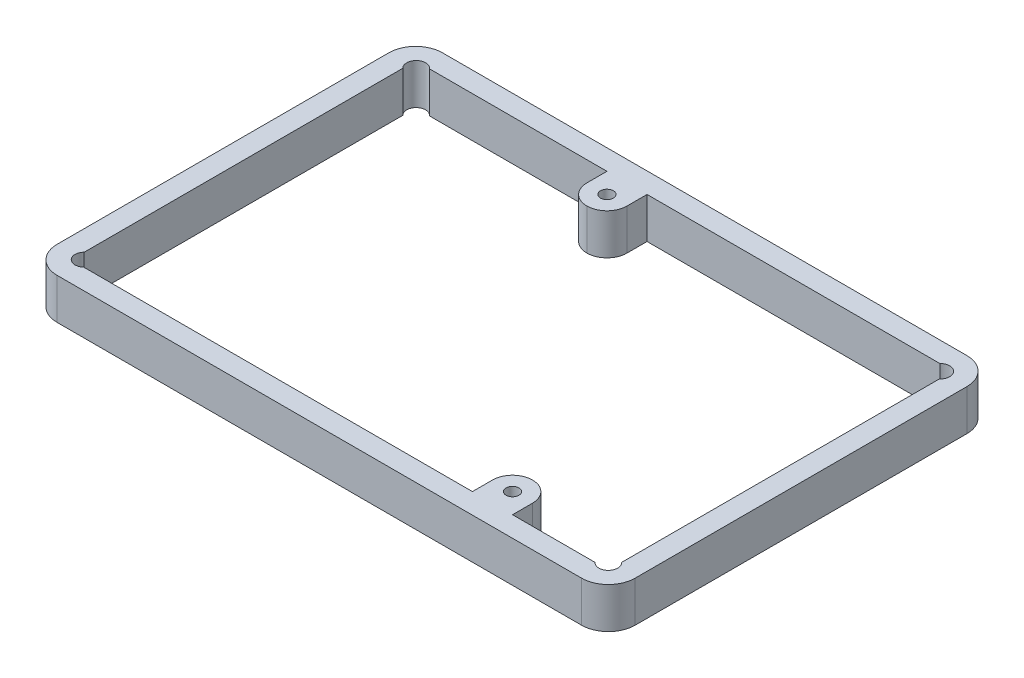
ISO-10303-21;
HEADER;
FILE_DESCRIPTION(('STEP AP214'),'2;1');
FILE_NAME('part.step','',(''),(''),'','','');
FILE_SCHEMA(('AUTOMOTIVE_DESIGN { 1 0 10303 214 1 1 1 1 }'));
ENDSEC;
DATA;
#1=APPLICATION_CONTEXT('core data for automotive mechanical design processes');
#2=APPLICATION_PROTOCOL_DEFINITION('international standard','automotive_design',2000,#1);
#3=PRODUCT_CONTEXT('',#1,'mechanical');
#4=PRODUCT('Part','Part','',(#3));
#5=PRODUCT_RELATED_PRODUCT_CATEGORY('part','',(#4));
#6=PRODUCT_DEFINITION_FORMATION('','',#4);
#7=PRODUCT_DEFINITION_CONTEXT('part definition',#1,'design');
#8=PRODUCT_DEFINITION('design','',#6,#7);
#9=PRODUCT_DEFINITION_SHAPE('','',#8);
#10=(LENGTH_UNIT() NAMED_UNIT(*) SI_UNIT(.MILLI.,.METRE.));
#11=(NAMED_UNIT(*) PLANE_ANGLE_UNIT() SI_UNIT($,.RADIAN.));
#12=(NAMED_UNIT(*) SI_UNIT($,.STERADIAN.) SOLID_ANGLE_UNIT());
#13=UNCERTAINTY_MEASURE_WITH_UNIT(LENGTH_MEASURE(1.E-05),#10,'distance_accuracy_value','');
#14=(GEOMETRIC_REPRESENTATION_CONTEXT(3) GLOBAL_UNCERTAINTY_ASSIGNED_CONTEXT((#13)) GLOBAL_UNIT_ASSIGNED_CONTEXT((#10,
#11,#12)) REPRESENTATION_CONTEXT('',''));
#15=CARTESIAN_POINT('',(0.,0.,0.));
#16=DIRECTION('',(0.,0.,1.));
#17=DIRECTION('',(1.,0.,0.));
#18=AXIS2_PLACEMENT_3D('',#15,#16,#17);
#19=CARTESIAN_POINT('',(-40.825,6.35,-26.825));
#20=DIRECTION('',(0.,0.,1.));
#21=DIRECTION('',(1.,0.,0.));
#22=AXIS2_PLACEMENT_3D('',#19,#20,#21);
#23=PLANE('',#22);
#24=DIRECTION('',(-1.,0.,0.));
#25=VECTOR('',#24,1.);
#26=CARTESIAN_POINT('',(-40.825,6.35,-26.825));
#27=LINE('',#26,#25);
#28=CARTESIAN_POINT('',(39.7878719398534,6.35,-26.825));
#29=VERTEX_POINT('',#28);
#30=CARTESIAN_POINT('',(-5.80393673049254,6.35,-26.825));
#31=VERTEX_POINT('',#30);
#32=EDGE_CURVE('E208',#29,#31,#27,.T.);
#33=ORIENTED_EDGE('',*,*,#32,.T.);
#34=DIRECTION('',(0.,1.,0.));
#35=VECTOR('',#34,1.);
#36=CARTESIAN_POINT('',(-5.80393673049254,6.35,-26.825));
#37=LINE('',#36,#35);
#38=CARTESIAN_POINT('',(-5.80393673049253,0.,-26.825));
#39=VERTEX_POINT('',#38);
#40=EDGE_CURVE('E218',#39,#31,#37,.T.);
#41=ORIENTED_EDGE('',*,*,#40,.F.);
#42=DIRECTION('',(-1.,0.,0.));
#43=VECTOR('',#42,1.);
#44=CARTESIAN_POINT('',(-40.825,0.,-26.825));
#45=LINE('',#44,#43);
#46=CARTESIAN_POINT('',(39.7878719398534,0.,-26.825));
#47=VERTEX_POINT('',#46);
#48=EDGE_CURVE('E245',#47,#39,#45,.T.);
#49=ORIENTED_EDGE('',*,*,#48,.F.);
#50=DIRECTION('',(0.,-1.,0.));
#51=VECTOR('',#50,1.);
#52=CARTESIAN_POINT('',(39.7878719398534,6.35,-26.825));
#53=LINE('',#52,#51);
#54=EDGE_CURVE('E228',#29,#47,#53,.T.);
#55=ORIENTED_EDGE('',*,*,#54,.F.);
#56=EDGE_LOOP('',(#33,#41,#49,#55));
#57=FACE_BOUND('',#56,.T.);
#58=ADVANCED_FACE('F32',(#57),#23,.T.);
#59=CARTESIAN_POINT('',(-12.0439367304925,0.,-26.825));
#60=VERTEX_POINT('',#59);
#61=CARTESIAN_POINT('',(-39.6675293004392,0.,-26.825));
#62=VERTEX_POINT('',#61);
#63=EDGE_CURVE('E244',#60,#62,#45,.T.);
#64=ORIENTED_EDGE('',*,*,#63,.F.);
#65=DIRECTION('',(0.,-1.,0.));
#66=VECTOR('',#65,1.);
#67=CARTESIAN_POINT('',(-12.0439367304925,6.35,-26.825));
#68=LINE('',#67,#66);
#69=CARTESIAN_POINT('',(-12.0439367304925,6.35,-26.825));
#70=VERTEX_POINT('',#69);
#71=EDGE_CURVE('E224',#70,#60,#68,.T.);
#72=ORIENTED_EDGE('',*,*,#71,.F.);
#73=CARTESIAN_POINT('',(-39.6675293004392,6.35,-26.825));
#74=VERTEX_POINT('',#73);
#75=EDGE_CURVE('E230',#70,#74,#27,.T.);
#76=ORIENTED_EDGE('',*,*,#75,.T.);
#77=DIRECTION('',(0.,-1.,0.));
#78=VECTOR('',#77,1.);
#79=CARTESIAN_POINT('',(-39.6675293004392,6.35,-26.825));
#80=LINE('',#79,#78);
#81=EDGE_CURVE('E352',#62,#74,#80,.F.);
#82=ORIENTED_EDGE('',*,*,#81,.F.);
#83=EDGE_LOOP('',(#64,#72,#76,#82));
#84=FACE_BOUND('',#83,.T.);
#85=ADVANCED_FACE('F456',(#84),#23,.T.);
#86=CARTESIAN_POINT('',(40.825,6.35,26.825));
#87=DIRECTION('',(0.,0.,-1.));
#88=DIRECTION('',(-1.,0.,0.));
#89=AXIS2_PLACEMENT_3D('',#86,#87,#88);
#90=PLANE('',#89);
#91=DIRECTION('',(0.,-1.,0.));
#92=VECTOR('',#91,1.);
#93=CARTESIAN_POINT('',(39.7431875208702,6.35,26.825));
#94=LINE('',#93,#92);
#95=CARTESIAN_POINT('',(39.7431875208702,0.,26.825));
#96=VERTEX_POINT('',#95);
#97=CARTESIAN_POINT('',(39.7431875208702,6.35,26.825));
#98=VERTEX_POINT('',#97);
#99=EDGE_CURVE('E367',#96,#98,#94,.F.);
#100=ORIENTED_EDGE('',*,*,#99,.F.);
#101=DIRECTION('',(1.,0.,0.));
#102=VECTOR('',#101,1.);
#103=CARTESIAN_POINT('',(40.825,0.,26.825));
#104=LINE('',#103,#102);
#105=CARTESIAN_POINT('',(26.905,0.,26.825));
#106=VERTEX_POINT('',#105);
#107=EDGE_CURVE('E241',#106,#96,#104,.T.);
#108=ORIENTED_EDGE('',*,*,#107,.F.);
#109=DIRECTION('',(0.,-1.,0.));
#110=VECTOR('',#109,1.);
#111=CARTESIAN_POINT('',(26.905,6.35,26.825));
#112=LINE('',#111,#110);
#113=CARTESIAN_POINT('',(26.905,6.35,26.825));
#114=VERTEX_POINT('',#113);
#115=EDGE_CURVE('E324',#114,#106,#112,.T.);
#116=ORIENTED_EDGE('',*,*,#115,.F.);
#117=DIRECTION('',(1.,0.,0.));
#118=VECTOR('',#117,1.);
#119=CARTESIAN_POINT('',(40.825,6.35,26.825));
#120=LINE('',#119,#118);
#121=EDGE_CURVE('E249',#114,#98,#120,.T.);
#122=ORIENTED_EDGE('',*,*,#121,.T.);
#123=EDGE_LOOP('',(#100,#108,#116,#122));
#124=FACE_BOUND('',#123,.T.);
#125=ADVANCED_FACE('F408',(#124),#90,.T.);
#126=DIRECTION('',(0.,-1.,0.));
#127=VECTOR('',#126,1.);
#128=CARTESIAN_POINT('',(-39.860633754228,6.35,26.825));
#129=LINE('',#128,#127);
#130=CARTESIAN_POINT('',(-39.860633754228,6.35,26.825));
#131=VERTEX_POINT('',#130);
#132=CARTESIAN_POINT('',(-39.860633754228,0.,26.825));
#133=VERTEX_POINT('',#132);
#134=EDGE_CURVE('E374',#131,#133,#129,.T.);
#135=ORIENTED_EDGE('',*,*,#134,.F.);
#136=CARTESIAN_POINT('',(20.665,6.35,26.825));
#137=VERTEX_POINT('',#136);
#138=EDGE_CURVE('E397',#131,#137,#120,.T.);
#139=ORIENTED_EDGE('',*,*,#138,.T.);
#140=DIRECTION('',(0.,1.,0.));
#141=VECTOR('',#140,1.);
#142=CARTESIAN_POINT('',(20.665,6.35,26.825));
#143=LINE('',#142,#141);
#144=CARTESIAN_POINT('',(20.665,0.,26.825));
#145=VERTEX_POINT('',#144);
#146=EDGE_CURVE('E385',#145,#137,#143,.T.);
#147=ORIENTED_EDGE('',*,*,#146,.F.);
#148=EDGE_CURVE('E238',#133,#145,#104,.T.);
#149=ORIENTED_EDGE('',*,*,#148,.F.);
#150=EDGE_LOOP('',(#135,#139,#147,#149));
#151=FACE_BOUND('',#150,.T.);
#152=ADVANCED_FACE('F440',(#151),#90,.T.);
#153=CARTESIAN_POINT('',(-40.825,6.35,-25.825));
#154=DIRECTION('',(0.,1.,0.));
#155=DIRECTION('',(0.,0.,1.));
#156=AXIS2_PLACEMENT_3D('',#153,#154,#155);
#157=PLANE('',#156);
#158=CARTESIAN_POINT('',(-8.92393673049253,6.35,-23.705));
#159=DIRECTION('',(0.,-1.,0.));
#160=DIRECTION('',(0.,0.,-1.));
#161=AXIS2_PLACEMENT_3D('',#158,#159,#160);
#162=CIRCLE('',#161,1.);
#163=CARTESIAN_POINT('',(-8.92393673049253,6.35,-24.705));
#164=VERTEX_POINT('',#163);
#165=EDGE_CURVE('E225',#164,#164,#162,.T.);
#166=ORIENTED_EDGE('',*,*,#165,.T.);
#167=EDGE_LOOP('',(#166));
#168=FACE_BOUND('',#167,.T.);
#169=CARTESIAN_POINT('',(-8.92393673049254,6.35,-23.705));
#170=DIRECTION('',(0.,1.,0.));
#171=DIRECTION('',(0.,0.,1.));
#172=AXIS2_PLACEMENT_3D('',#169,#170,#171);
#173=CIRCLE('',#172,3.12);
#174=CARTESIAN_POINT('',(-12.0439367304925,6.35,-23.705));
#175=VERTEX_POINT('',#174);
#176=CARTESIAN_POINT('',(-8.92393673049254,6.35,-20.585));
#177=VERTEX_POINT('',#176);
#178=EDGE_CURVE('E333',#175,#177,#173,.T.);
#179=ORIENTED_EDGE('',*,*,#178,.T.);
#180=CARTESIAN_POINT('',(-8.92393673049254,6.35,-23.705));
#181=DIRECTION('',(0.,1.,0.));
#182=DIRECTION('',(0.,0.,1.));
#183=AXIS2_PLACEMENT_3D('',#180,#181,#182);
#184=CIRCLE('',#183,3.12);
#185=CARTESIAN_POINT('',(-5.80393673049254,6.35,-23.705));
#186=VERTEX_POINT('',#185);
#187=EDGE_CURVE('E210',#177,#186,#184,.T.);
#188=ORIENTED_EDGE('',*,*,#187,.T.);
#189=DIRECTION('',(0.,0.,-1.));
#190=VECTOR('',#189,1.);
#191=CARTESIAN_POINT('',(-5.80393673049254,6.35,-20.585));
#192=LINE('',#191,#190);
#193=EDGE_CURVE('E202',#186,#31,#192,.T.);
#194=ORIENTED_EDGE('',*,*,#193,.T.);
#195=ORIENTED_EDGE('',*,*,#32,.F.);
#196=CARTESIAN_POINT('',(40.8602295298414,6.35,-25.8148676130352));
#197=DIRECTION('',(0.,-1.,0.));
#198=DIRECTION('',(0.,0.,-1.));
#199=AXIS2_PLACEMENT_3D('',#196,#197,#198);
#200=CIRCLE('',#199,1.4732);
#201=CARTESIAN_POINT('',(41.825,6.35,-24.7015230213162));
#202=VERTEX_POINT('',#201);
#203=EDGE_CURVE('E358',#29,#202,#200,.T.);
#204=ORIENTED_EDGE('',*,*,#203,.T.);
#205=DIRECTION('',(0.,0.,-1.));
#206=VECTOR('',#205,1.);
#207=CARTESIAN_POINT('',(41.825,6.35,-25.825));
#208=LINE('',#207,#206);
#209=CARTESIAN_POINT('',(41.825,6.35,24.7431875208712));
#210=VERTEX_POINT('',#209);
#211=EDGE_CURVE('E234',#210,#202,#208,.T.);
#212=ORIENTED_EDGE('',*,*,#211,.F.);
#213=CARTESIAN_POINT('',(40.8250000000004,6.35,25.8250000000009));
#214=DIRECTION('',(0.,-1.,0.));
#215=DIRECTION('',(0.,0.,-1.));
#216=AXIS2_PLACEMENT_3D('',#213,#214,#215);
#217=CIRCLE('',#216,1.47320000000001);
#218=EDGE_CURVE('E364',#210,#98,#217,.T.);
#219=ORIENTED_EDGE('',*,*,#218,.T.);
#220=ORIENTED_EDGE('',*,*,#121,.F.);
#221=DIRECTION('',(0.,0.,1.));
#222=VECTOR('',#221,1.);
#223=CARTESIAN_POINT('',(26.905,6.35,20.585));
#224=LINE('',#223,#222);
#225=CARTESIAN_POINT('',(26.905,6.35,23.705));
#226=VERTEX_POINT('',#225);
#227=EDGE_CURVE('E388',#226,#114,#224,.T.);
#228=ORIENTED_EDGE('',*,*,#227,.F.);
#229=CARTESIAN_POINT('',(23.785,6.35,23.705));
#230=DIRECTION('',(0.,1.,0.));
#231=DIRECTION('',(0.,0.,1.));
#232=AXIS2_PLACEMENT_3D('',#229,#230,#231);
#233=CIRCLE('',#232,3.12);
#234=CARTESIAN_POINT('',(23.785,6.35,20.585));
#235=VERTEX_POINT('',#234);
#236=EDGE_CURVE('E307',#226,#235,#233,.T.);
#237=ORIENTED_EDGE('',*,*,#236,.T.);
#238=CARTESIAN_POINT('',(23.785,6.35,23.705));
#239=DIRECTION('',(0.,1.,0.));
#240=DIRECTION('',(0.,0.,1.));
#241=AXIS2_PLACEMENT_3D('',#238,#239,#240);
#242=CIRCLE('',#241,3.12);
#243=CARTESIAN_POINT('',(20.665,6.35,23.705));
#244=VERTEX_POINT('',#243);
#245=EDGE_CURVE('E309',#235,#244,#242,.T.);
#246=ORIENTED_EDGE('',*,*,#245,.T.);
#247=DIRECTION('',(0.,0.,1.));
#248=VECTOR('',#247,1.);
#249=CARTESIAN_POINT('',(20.665,6.35,20.585));
#250=LINE('',#249,#248);
#251=EDGE_CURVE('E390',#244,#137,#250,.T.);
#252=ORIENTED_EDGE('',*,*,#251,.T.);
#253=ORIENTED_EDGE('',*,*,#138,.F.);
#254=CARTESIAN_POINT('',(-40.8249879035781,6.35,25.7794174663704));
#255=DIRECTION('',(0.,-1.,0.));
#256=DIRECTION('',(0.,0.,-1.));
#257=AXIS2_PLACEMENT_3D('',#254,#255,#256);
#258=CIRCLE('',#257,1.42240000000001);
#259=CARTESIAN_POINT('',(-41.825,6.35,24.7678851796835));
#260=VERTEX_POINT('',#259);
#261=EDGE_CURVE('E371',#131,#260,#258,.T.);
#262=ORIENTED_EDGE('',*,*,#261,.T.);
#263=DIRECTION('',(0.,0.,1.));
#264=VECTOR('',#263,1.);
#265=CARTESIAN_POINT('',(-41.825,6.35,25.825));
#266=LINE('',#265,#264);
#267=CARTESIAN_POINT('',(-41.825,6.35,-24.8224394536896));
#268=VERTEX_POINT('',#267);
#269=EDGE_CURVE('E229',#268,#260,#266,.T.);
#270=ORIENTED_EDGE('',*,*,#269,.F.);
#271=CARTESIAN_POINT('',(-40.7897514694633,6.35,-25.8705705142072));
#272=DIRECTION('',(0.,-1.,0.));
#273=DIRECTION('',(0.,0.,-1.));
#274=AXIS2_PLACEMENT_3D('',#271,#272,#273);
#275=CIRCLE('',#274,1.4732);
#276=EDGE_CURVE('E349',#268,#74,#275,.T.);
#277=ORIENTED_EDGE('',*,*,#276,.T.);
#278=ORIENTED_EDGE('',*,*,#75,.F.);
#279=DIRECTION('',(0.,0.,-1.));
#280=VECTOR('',#279,1.);
#281=CARTESIAN_POINT('',(-12.0439367304925,6.35,-20.585));
#282=LINE('',#281,#280);
#283=EDGE_CURVE('E215',#175,#70,#282,.T.);
#284=ORIENTED_EDGE('',*,*,#283,.F.);
#285=EDGE_LOOP('',(#179,#188,#194,#195,#204,#212,#219,#220,#228,#237,#246,#252,#253,#262,#270,
#277,#278,#284));
#286=FACE_BOUND('',#285,.T.);
#287=CARTESIAN_POINT('',(23.785,6.35,23.705));
#288=DIRECTION('',(0.,-1.,0.));
#289=DIRECTION('',(0.,0.,-1.));
#290=AXIS2_PLACEMENT_3D('',#287,#288,#289);
#291=CIRCLE('',#290,0.999999999978836);
#292=CARTESIAN_POINT('',(23.785,6.35,22.7050000000211));
#293=VERTEX_POINT('',#292);
#294=EDGE_CURVE('E325',#293,#293,#291,.T.);
#295=ORIENTED_EDGE('',*,*,#294,.T.);
#296=EDGE_LOOP('',(#295));
#297=FACE_BOUND('',#296,.T.);
#298=CARTESIAN_POINT('',(-40.825,6.35,-25.825));
#299=DIRECTION('',(0.,1.,0.));
#300=DIRECTION('',(0.,0.,1.));
#301=AXIS2_PLACEMENT_3D('',#298,#299,#300);
#302=CIRCLE('',#301,4.17499999999999);
#303=CARTESIAN_POINT('',(-40.825,6.35,-30.));
#304=VERTEX_POINT('',#303);
#305=CARTESIAN_POINT('',(-45.,6.35,-25.825));
#306=VERTEX_POINT('',#305);
#307=EDGE_CURVE('E250',#304,#306,#302,.T.);
#308=ORIENTED_EDGE('',*,*,#307,.T.);
#309=DIRECTION('',(0.,0.,1.));
#310=VECTOR('',#309,1.);
#311=CARTESIAN_POINT('',(-45.,6.35,-25.825));
#312=LINE('',#311,#310);
#313=CARTESIAN_POINT('',(-45.,6.35,25.825));
#314=VERTEX_POINT('',#313);
#315=EDGE_CURVE('E253',#306,#314,#312,.T.);
#316=ORIENTED_EDGE('',*,*,#315,.T.);
#317=CARTESIAN_POINT('',(-40.825,6.35,25.825));
#318=DIRECTION('',(0.,1.,0.));
#319=DIRECTION('',(0.,0.,1.));
#320=AXIS2_PLACEMENT_3D('',#317,#318,#319);
#321=CIRCLE('',#320,4.17500000000001);
#322=CARTESIAN_POINT('',(-40.825,6.35,30.));
#323=VERTEX_POINT('',#322);
#324=EDGE_CURVE('E256',#314,#323,#321,.T.);
#325=ORIENTED_EDGE('',*,*,#324,.T.);
#326=DIRECTION('',(1.,0.,0.));
#327=VECTOR('',#326,1.);
#328=CARTESIAN_POINT('',(-40.825,6.35,30.));
#329=LINE('',#328,#327);
#330=CARTESIAN_POINT('',(40.825,6.35,30.));
#331=VERTEX_POINT('',#330);
#332=EDGE_CURVE('E258',#323,#331,#329,.T.);
#333=ORIENTED_EDGE('',*,*,#332,.T.);
#334=CARTESIAN_POINT('',(40.825,6.35,25.825));
#335=DIRECTION('',(0.,1.,0.));
#336=DIRECTION('',(0.,0.,1.));
#337=AXIS2_PLACEMENT_3D('',#334,#335,#336);
#338=CIRCLE('',#337,4.17499999999999);
#339=CARTESIAN_POINT('',(45.,6.35,25.825));
#340=VERTEX_POINT('',#339);
#341=EDGE_CURVE('E260',#331,#340,#338,.T.);
#342=ORIENTED_EDGE('',*,*,#341,.T.);
#343=DIRECTION('',(0.,0.,-1.));
#344=VECTOR('',#343,1.);
#345=CARTESIAN_POINT('',(45.,6.35,-25.825));
#346=LINE('',#345,#344);
#347=CARTESIAN_POINT('',(45.,6.35,-25.825));
#348=VERTEX_POINT('',#347);
#349=EDGE_CURVE('E262',#340,#348,#346,.T.);
#350=ORIENTED_EDGE('',*,*,#349,.T.);
#351=CARTESIAN_POINT('',(40.825,6.35,-25.825));
#352=DIRECTION('',(0.,1.,0.));
#353=DIRECTION('',(0.,0.,1.));
#354=AXIS2_PLACEMENT_3D('',#351,#352,#353);
#355=CIRCLE('',#354,4.175);
#356=CARTESIAN_POINT('',(40.825,6.35,-30.));
#357=VERTEX_POINT('',#356);
#358=EDGE_CURVE('E264',#348,#357,#355,.T.);
#359=ORIENTED_EDGE('',*,*,#358,.T.);
#360=DIRECTION('',(-1.,0.,0.));
#361=VECTOR('',#360,1.);
#362=CARTESIAN_POINT('',(-40.825,6.35,-30.));
#363=LINE('',#362,#361);
#364=EDGE_CURVE('E266',#357,#304,#363,.T.);
#365=ORIENTED_EDGE('',*,*,#364,.T.);
#366=EDGE_LOOP('',(#308,#316,#325,#333,#342,#350,#359,#365));
#367=FACE_BOUND('',#366,.T.);
#368=ADVANCED_FACE('F204',(#168,#286,#297,#367),#157,.T.);
#369=CARTESIAN_POINT('',(-40.825,0.,-25.825));
#370=DIRECTION('',(0.,1.,0.));
#371=DIRECTION('',(0.,0.,1.));
#372=AXIS2_PLACEMENT_3D('',#369,#370,#371);
#373=PLANE('',#372);
#374=CARTESIAN_POINT('',(-8.92393673049253,0.,-23.705));
#375=DIRECTION('',(0.,-1.,0.));
#376=DIRECTION('',(0.,0.,-1.));
#377=AXIS2_PLACEMENT_3D('',#374,#375,#376);
#378=CIRCLE('',#377,1.);
#379=CARTESIAN_POINT('',(-8.92393673049253,0.,-24.705));
#380=VERTEX_POINT('',#379);
#381=EDGE_CURVE('E465',#380,#380,#378,.T.);
#382=ORIENTED_EDGE('',*,*,#381,.F.);
#383=EDGE_LOOP('',(#382));
#384=FACE_BOUND('',#383,.T.);
#385=CARTESIAN_POINT('',(23.785,0.,23.705));
#386=DIRECTION('',(0.,-1.,0.));
#387=DIRECTION('',(0.,0.,-1.));
#388=AXIS2_PLACEMENT_3D('',#385,#386,#387);
#389=CIRCLE('',#388,0.999999999978836);
#390=CARTESIAN_POINT('',(23.785,0.,22.7050000000211));
#391=VERTEX_POINT('',#390);
#392=EDGE_CURVE('E378',#391,#391,#389,.T.);
#393=ORIENTED_EDGE('',*,*,#392,.F.);
#394=EDGE_LOOP('',(#393));
#395=FACE_BOUND('',#394,.T.);
#396=CARTESIAN_POINT('',(-40.825,0.,-25.825));
#397=DIRECTION('',(0.,1.,0.));
#398=DIRECTION('',(0.,0.,1.));
#399=AXIS2_PLACEMENT_3D('',#396,#397,#398);
#400=CIRCLE('',#399,4.17499999999999);
#401=CARTESIAN_POINT('',(-40.825,0.,-30.));
#402=VERTEX_POINT('',#401);
#403=CARTESIAN_POINT('',(-45.,0.,-25.825));
#404=VERTEX_POINT('',#403);
#405=EDGE_CURVE('E232',#402,#404,#400,.T.);
#406=ORIENTED_EDGE('',*,*,#405,.F.);
#407=DIRECTION('',(-1.,0.,0.));
#408=VECTOR('',#407,1.);
#409=CARTESIAN_POINT('',(-40.825,0.,-30.));
#410=LINE('',#409,#408);
#411=CARTESIAN_POINT('',(40.825,0.,-30.));
#412=VERTEX_POINT('',#411);
#413=EDGE_CURVE('E254',#412,#402,#410,.T.);
#414=ORIENTED_EDGE('',*,*,#413,.F.);
#415=CARTESIAN_POINT('',(40.825,0.,-25.825));
#416=DIRECTION('',(0.,1.,0.));
#417=DIRECTION('',(0.,0.,1.));
#418=AXIS2_PLACEMENT_3D('',#415,#416,#417);
#419=CIRCLE('',#418,4.175);
#420=CARTESIAN_POINT('',(45.,0.,-25.825));
#421=VERTEX_POINT('',#420);
#422=EDGE_CURVE('E281',#421,#412,#419,.T.);
#423=ORIENTED_EDGE('',*,*,#422,.F.);
#424=DIRECTION('',(0.,0.,-1.));
#425=VECTOR('',#424,1.);
#426=CARTESIAN_POINT('',(45.,0.,-25.825));
#427=LINE('',#426,#425);
#428=CARTESIAN_POINT('',(45.,0.,25.825));
#429=VERTEX_POINT('',#428);
#430=EDGE_CURVE('E279',#429,#421,#427,.T.);
#431=ORIENTED_EDGE('',*,*,#430,.F.);
#432=CARTESIAN_POINT('',(40.825,0.,25.825));
#433=DIRECTION('',(0.,1.,0.));
#434=DIRECTION('',(0.,0.,1.));
#435=AXIS2_PLACEMENT_3D('',#432,#433,#434);
#436=CIRCLE('',#435,4.17499999999999);
#437=CARTESIAN_POINT('',(40.825,0.,30.));
#438=VERTEX_POINT('',#437);
#439=EDGE_CURVE('E277',#438,#429,#436,.T.);
#440=ORIENTED_EDGE('',*,*,#439,.F.);
#441=DIRECTION('',(1.,0.,0.));
#442=VECTOR('',#441,1.);
#443=CARTESIAN_POINT('',(-40.825,0.,30.));
#444=LINE('',#443,#442);
#445=CARTESIAN_POINT('',(-40.825,0.,30.));
#446=VERTEX_POINT('',#445);
#447=EDGE_CURVE('E275',#446,#438,#444,.T.);
#448=ORIENTED_EDGE('',*,*,#447,.F.);
#449=CARTESIAN_POINT('',(-40.825,0.,25.825));
#450=DIRECTION('',(0.,1.,0.));
#451=DIRECTION('',(0.,0.,1.));
#452=AXIS2_PLACEMENT_3D('',#449,#450,#451);
#453=CIRCLE('',#452,4.17500000000001);
#454=CARTESIAN_POINT('',(-45.,0.,25.825));
#455=VERTEX_POINT('',#454);
#456=EDGE_CURVE('E273',#455,#446,#453,.T.);
#457=ORIENTED_EDGE('',*,*,#456,.F.);
#458=DIRECTION('',(0.,0.,1.));
#459=VECTOR('',#458,1.);
#460=CARTESIAN_POINT('',(-45.,0.,-25.825));
#461=LINE('',#460,#459);
#462=EDGE_CURVE('E271',#404,#455,#461,.T.);
#463=ORIENTED_EDGE('',*,*,#462,.F.);
#464=EDGE_LOOP('',(#406,#414,#423,#431,#440,#448,#457,#463));
#465=FACE_BOUND('',#464,.T.);
#466=DIRECTION('',(0.,0.,-1.));
#467=VECTOR('',#466,1.);
#468=CARTESIAN_POINT('',(-5.80393673049253,0.,-20.585));
#469=LINE('',#468,#467);
#470=CARTESIAN_POINT('',(-5.80393673049253,0.,-23.705));
#471=VERTEX_POINT('',#470);
#472=EDGE_CURVE('E220',#471,#39,#469,.T.);
#473=ORIENTED_EDGE('',*,*,#472,.F.);
#474=CARTESIAN_POINT('',(-8.92393673049253,0.,-23.705));
#475=DIRECTION('',(0.,1.,0.));
#476=DIRECTION('',(0.,0.,1.));
#477=AXIS2_PLACEMENT_3D('',#474,#475,#476);
#478=CIRCLE('',#477,3.12);
#479=CARTESIAN_POINT('',(-8.92393673049254,0.,-20.585));
#480=VERTEX_POINT('',#479);
#481=EDGE_CURVE('E41',#471,#480,#478,.F.);
#482=ORIENTED_EDGE('',*,*,#481,.T.);
#483=CARTESIAN_POINT('',(-8.92393673049254,0.,-23.705));
#484=DIRECTION('',(0.,1.,0.));
#485=DIRECTION('',(0.,0.,1.));
#486=AXIS2_PLACEMENT_3D('',#483,#484,#485);
#487=CIRCLE('',#486,3.12);
#488=CARTESIAN_POINT('',(-12.0439367304925,0.,-23.705));
#489=VERTEX_POINT('',#488);
#490=EDGE_CURVE('E48',#480,#489,#487,.F.);
#491=ORIENTED_EDGE('',*,*,#490,.T.);
#492=DIRECTION('',(0.,0.,-1.));
#493=VECTOR('',#492,1.);
#494=CARTESIAN_POINT('',(-12.0439367304925,0.,-20.585));
#495=LINE('',#494,#493);
#496=EDGE_CURVE('E342',#489,#60,#495,.T.);
#497=ORIENTED_EDGE('',*,*,#496,.T.);
#498=ORIENTED_EDGE('',*,*,#63,.T.);
#499=CARTESIAN_POINT('',(-40.7897514694633,0.,-25.8705705142072));
#500=DIRECTION('',(0.,-1.,0.));
#501=DIRECTION('',(0.,0.,-1.));
#502=AXIS2_PLACEMENT_3D('',#499,#500,#501);
#503=CIRCLE('',#502,1.4732);
#504=CARTESIAN_POINT('',(-41.825,0.,-24.8224394536896));
#505=VERTEX_POINT('',#504);
#506=EDGE_CURVE('E214',#505,#62,#503,.T.);
#507=ORIENTED_EDGE('',*,*,#506,.F.);
#508=DIRECTION('',(0.,0.,1.));
#509=VECTOR('',#508,1.);
#510=CARTESIAN_POINT('',(-41.825,0.,25.825));
#511=LINE('',#510,#509);
#512=CARTESIAN_POINT('',(-41.825,0.,24.7678851796835));
#513=VERTEX_POINT('',#512);
#514=EDGE_CURVE('E247',#505,#513,#511,.T.);
#515=ORIENTED_EDGE('',*,*,#514,.T.);
#516=CARTESIAN_POINT('',(-40.8249879035781,0.,25.7794174663704));
#517=DIRECTION('',(0.,-1.,0.));
#518=DIRECTION('',(0.,0.,-1.));
#519=AXIS2_PLACEMENT_3D('',#516,#517,#518);
#520=CIRCLE('',#519,1.42240000000001);
#521=EDGE_CURVE('E370',#133,#513,#520,.T.);
#522=ORIENTED_EDGE('',*,*,#521,.F.);
#523=ORIENTED_EDGE('',*,*,#148,.T.);
#524=DIRECTION('',(0.,0.,1.));
#525=VECTOR('',#524,1.);
#526=CARTESIAN_POINT('',(20.665,0.,20.585));
#527=LINE('',#526,#525);
#528=CARTESIAN_POINT('',(20.665,0.,23.705));
#529=VERTEX_POINT('',#528);
#530=EDGE_CURVE('E393',#529,#145,#527,.T.);
#531=ORIENTED_EDGE('',*,*,#530,.F.);
#532=CARTESIAN_POINT('',(23.785,0.,23.705));
#533=DIRECTION('',(0.,1.,0.));
#534=DIRECTION('',(0.,0.,1.));
#535=AXIS2_PLACEMENT_3D('',#532,#533,#534);
#536=CIRCLE('',#535,3.12);
#537=CARTESIAN_POINT('',(23.785,0.,20.585));
#538=VERTEX_POINT('',#537);
#539=EDGE_CURVE('E316',#529,#538,#536,.F.);
#540=ORIENTED_EDGE('',*,*,#539,.T.);
#541=CARTESIAN_POINT('',(23.785,0.,23.705));
#542=DIRECTION('',(0.,1.,0.));
#543=DIRECTION('',(0.,0.,1.));
#544=AXIS2_PLACEMENT_3D('',#541,#542,#543);
#545=CIRCLE('',#544,3.12);
#546=CARTESIAN_POINT('',(26.905,0.,23.705));
#547=VERTEX_POINT('',#546);
#548=EDGE_CURVE('E314',#538,#547,#545,.F.);
#549=ORIENTED_EDGE('',*,*,#548,.T.);
#550=DIRECTION('',(0.,0.,1.));
#551=VECTOR('',#550,1.);
#552=CARTESIAN_POINT('',(26.905,0.,20.585));
#553=LINE('',#552,#551);
#554=EDGE_CURVE('E396',#547,#106,#553,.T.);
#555=ORIENTED_EDGE('',*,*,#554,.T.);
#556=ORIENTED_EDGE('',*,*,#107,.T.);
#557=CARTESIAN_POINT('',(40.8250000000004,0.,25.8250000000009));
#558=DIRECTION('',(0.,-1.,0.));
#559=DIRECTION('',(0.,0.,-1.));
#560=AXIS2_PLACEMENT_3D('',#557,#558,#559);
#561=CIRCLE('',#560,1.47320000000001);
#562=CARTESIAN_POINT('',(41.825,0.,24.7431875208712));
#563=VERTEX_POINT('',#562);
#564=EDGE_CURVE('E363',#563,#96,#561,.T.);
#565=ORIENTED_EDGE('',*,*,#564,.F.);
#566=DIRECTION('',(0.,0.,-1.));
#567=VECTOR('',#566,1.);
#568=CARTESIAN_POINT('',(41.825,0.,-25.825));
#569=LINE('',#568,#567);
#570=CARTESIAN_POINT('',(41.825,0.,-24.7015230213162));
#571=VERTEX_POINT('',#570);
#572=EDGE_CURVE('E240',#563,#571,#569,.T.);
#573=ORIENTED_EDGE('',*,*,#572,.T.);
#574=CARTESIAN_POINT('',(40.8602295298414,0.,-25.8148676130352));
#575=DIRECTION('',(0.,-1.,0.));
#576=DIRECTION('',(0.,0.,-1.));
#577=AXIS2_PLACEMENT_3D('',#574,#575,#576);
#578=CIRCLE('',#577,1.4732);
#579=EDGE_CURVE('E357',#47,#571,#578,.T.);
#580=ORIENTED_EDGE('',*,*,#579,.F.);
#581=ORIENTED_EDGE('',*,*,#48,.T.);
#582=EDGE_LOOP('',(#473,#482,#491,#497,#498,#507,#515,#522,#523,#531,#540,#549,#555,#556,#565,
#573,#580,#581));
#583=FACE_BOUND('',#582,.T.);
#584=ADVANCED_FACE('F340',(#384,#395,#465,#583),#373,.F.);
#585=CARTESIAN_POINT('',(-40.825,6.35,-25.825));
#586=DIRECTION('',(0.,-1.,0.));
#587=DIRECTION('',(0.,0.,-1.));
#588=AXIS2_PLACEMENT_3D('',#585,#586,#587);
#589=CYLINDRICAL_SURFACE('',#588,4.17499999999999);
#590=ORIENTED_EDGE('',*,*,#405,.T.);
#591=DIRECTION('',(0.,-1.,0.));
#592=VECTOR('',#591,1.);
#593=CARTESIAN_POINT('',(-45.,6.35,-25.825));
#594=LINE('',#593,#592);
#595=EDGE_CURVE('E304',#306,#404,#594,.T.);
#596=ORIENTED_EDGE('',*,*,#595,.F.);
#597=ORIENTED_EDGE('',*,*,#307,.F.);
#598=DIRECTION('',(0.,-1.,0.));
#599=VECTOR('',#598,1.);
#600=CARTESIAN_POINT('',(-40.825,6.35,-30.));
#601=LINE('',#600,#599);
#602=EDGE_CURVE('E268',#304,#402,#601,.T.);
#603=ORIENTED_EDGE('',*,*,#602,.T.);
#604=EDGE_LOOP('',(#590,#596,#597,#603));
#605=FACE_BOUND('',#604,.T.);
#606=ADVANCED_FACE('F491',(#605),#589,.T.);
#607=CARTESIAN_POINT('',(-45.,6.35,-25.825));
#608=DIRECTION('',(1.,0.,0.));
#609=DIRECTION('',(0.,0.,-1.));
#610=AXIS2_PLACEMENT_3D('',#607,#608,#609);
#611=PLANE('',#610);
#612=ORIENTED_EDGE('',*,*,#462,.T.);
#613=DIRECTION('',(0.,-1.,0.));
#614=VECTOR('',#613,1.);
#615=CARTESIAN_POINT('',(-45.,6.35,25.825));
#616=LINE('',#615,#614);
#617=EDGE_CURVE('E301',#314,#455,#616,.T.);
#618=ORIENTED_EDGE('',*,*,#617,.F.);
#619=ORIENTED_EDGE('',*,*,#315,.F.);
#620=ORIENTED_EDGE('',*,*,#595,.T.);
#621=EDGE_LOOP('',(#612,#618,#619,#620));
#622=FACE_BOUND('',#621,.T.);
#623=ADVANCED_FACE('F515',(#622),#611,.F.);
#624=CARTESIAN_POINT('',(-40.825,6.35,25.825));
#625=DIRECTION('',(0.,-1.,0.));
#626=DIRECTION('',(0.,0.,-1.));
#627=AXIS2_PLACEMENT_3D('',#624,#625,#626);
#628=CYLINDRICAL_SURFACE('',#627,4.17500000000001);
#629=ORIENTED_EDGE('',*,*,#456,.T.);
#630=DIRECTION('',(0.,-1.,0.));
#631=VECTOR('',#630,1.);
#632=CARTESIAN_POINT('',(-40.825,6.35,30.));
#633=LINE('',#632,#631);
#634=EDGE_CURVE('E298',#323,#446,#633,.T.);
#635=ORIENTED_EDGE('',*,*,#634,.F.);
#636=ORIENTED_EDGE('',*,*,#324,.F.);
#637=ORIENTED_EDGE('',*,*,#617,.T.);
#638=EDGE_LOOP('',(#629,#635,#636,#637));
#639=FACE_BOUND('',#638,.T.);
#640=ADVANCED_FACE('F511',(#639),#628,.T.);
#641=CARTESIAN_POINT('',(-40.825,6.35,30.));
#642=DIRECTION('',(0.,0.,-1.));
#643=DIRECTION('',(-1.,0.,0.));
#644=AXIS2_PLACEMENT_3D('',#641,#642,#643);
#645=PLANE('',#644);
#646=ORIENTED_EDGE('',*,*,#447,.T.);
#647=DIRECTION('',(0.,-1.,0.));
#648=VECTOR('',#647,1.);
#649=CARTESIAN_POINT('',(40.825,6.35,30.));
#650=LINE('',#649,#648);
#651=EDGE_CURVE('E295',#331,#438,#650,.T.);
#652=ORIENTED_EDGE('',*,*,#651,.F.);
#653=ORIENTED_EDGE('',*,*,#332,.F.);
#654=ORIENTED_EDGE('',*,*,#634,.T.);
#655=EDGE_LOOP('',(#646,#652,#653,#654));
#656=FACE_BOUND('',#655,.T.);
#657=ADVANCED_FACE('F507',(#656),#645,.F.);
#658=CARTESIAN_POINT('',(40.825,6.35,25.825));
#659=DIRECTION('',(0.,-1.,0.));
#660=DIRECTION('',(0.,0.,-1.));
#661=AXIS2_PLACEMENT_3D('',#658,#659,#660);
#662=CYLINDRICAL_SURFACE('',#661,4.17499999999999);
#663=ORIENTED_EDGE('',*,*,#439,.T.);
#664=DIRECTION('',(0.,-1.,0.));
#665=VECTOR('',#664,1.);
#666=CARTESIAN_POINT('',(45.,6.35,25.825));
#667=LINE('',#666,#665);
#668=EDGE_CURVE('E292',#340,#429,#667,.T.);
#669=ORIENTED_EDGE('',*,*,#668,.F.);
#670=ORIENTED_EDGE('',*,*,#341,.F.);
#671=ORIENTED_EDGE('',*,*,#651,.T.);
#672=EDGE_LOOP('',(#663,#669,#670,#671));
#673=FACE_BOUND('',#672,.T.);
#674=ADVANCED_FACE('F503',(#673),#662,.T.);
#675=CARTESIAN_POINT('',(45.,6.35,-25.825));
#676=DIRECTION('',(-1.,0.,0.));
#677=DIRECTION('',(0.,0.,1.));
#678=AXIS2_PLACEMENT_3D('',#675,#676,#677);
#679=PLANE('',#678);
#680=ORIENTED_EDGE('',*,*,#430,.T.);
#681=DIRECTION('',(0.,-1.,0.));
#682=VECTOR('',#681,1.);
#683=CARTESIAN_POINT('',(45.,6.35,-25.825));
#684=LINE('',#683,#682);
#685=EDGE_CURVE('E289',#348,#421,#684,.T.);
#686=ORIENTED_EDGE('',*,*,#685,.F.);
#687=ORIENTED_EDGE('',*,*,#349,.F.);
#688=ORIENTED_EDGE('',*,*,#668,.T.);
#689=EDGE_LOOP('',(#680,#686,#687,#688));
#690=FACE_BOUND('',#689,.T.);
#691=ADVANCED_FACE('F499',(#690),#679,.F.);
#692=CARTESIAN_POINT('',(40.825,6.35,-25.825));
#693=DIRECTION('',(0.,-1.,0.));
#694=DIRECTION('',(0.,0.,-1.));
#695=AXIS2_PLACEMENT_3D('',#692,#693,#694);
#696=CYLINDRICAL_SURFACE('',#695,4.175);
#697=ORIENTED_EDGE('',*,*,#422,.T.);
#698=DIRECTION('',(0.,-1.,0.));
#699=VECTOR('',#698,1.);
#700=CARTESIAN_POINT('',(40.825,6.35,-30.));
#701=LINE('',#700,#699);
#702=EDGE_CURVE('E286',#357,#412,#701,.T.);
#703=ORIENTED_EDGE('',*,*,#702,.F.);
#704=ORIENTED_EDGE('',*,*,#358,.F.);
#705=ORIENTED_EDGE('',*,*,#685,.T.);
#706=EDGE_LOOP('',(#697,#703,#704,#705));
#707=FACE_BOUND('',#706,.T.);
#708=ADVANCED_FACE('F495',(#707),#696,.T.);
#709=CARTESIAN_POINT('',(-40.825,6.35,-30.));
#710=DIRECTION('',(0.,0.,1.));
#711=DIRECTION('',(1.,0.,0.));
#712=AXIS2_PLACEMENT_3D('',#709,#710,#711);
#713=PLANE('',#712);
#714=ORIENTED_EDGE('',*,*,#413,.T.);
#715=ORIENTED_EDGE('',*,*,#602,.F.);
#716=ORIENTED_EDGE('',*,*,#364,.F.);
#717=ORIENTED_EDGE('',*,*,#702,.T.);
#718=EDGE_LOOP('',(#714,#715,#716,#717));
#719=FACE_BOUND('',#718,.T.);
#720=ADVANCED_FACE('F483',(#719),#713,.F.);
#721=CARTESIAN_POINT('',(41.825,6.35,-25.825));
#722=DIRECTION('',(-1.,0.,0.));
#723=DIRECTION('',(0.,0.,1.));
#724=AXIS2_PLACEMENT_3D('',#721,#722,#723);
#725=PLANE('',#724);
#726=DIRECTION('',(0.,-1.,0.));
#727=VECTOR('',#726,1.);
#728=CARTESIAN_POINT('',(41.825,6.35,-24.7015230213162));
#729=LINE('',#728,#727);
#730=EDGE_CURVE('E360',#571,#202,#729,.F.);
#731=ORIENTED_EDGE('',*,*,#730,.F.);
#732=ORIENTED_EDGE('',*,*,#572,.F.);
#733=DIRECTION('',(0.,-1.,0.));
#734=VECTOR('',#733,1.);
#735=CARTESIAN_POINT('',(41.825,6.35,24.7431875208712));
#736=LINE('',#735,#734);
#737=EDGE_CURVE('E328',#210,#563,#736,.T.);
#738=ORIENTED_EDGE('',*,*,#737,.F.);
#739=ORIENTED_EDGE('',*,*,#211,.T.);
#740=EDGE_LOOP('',(#731,#732,#738,#739));
#741=FACE_BOUND('',#740,.T.);
#742=ADVANCED_FACE('F421',(#741),#725,.T.);
#743=CARTESIAN_POINT('',(-41.825,6.35,25.825));
#744=DIRECTION('',(1.,0.,0.));
#745=DIRECTION('',(0.,0.,-1.));
#746=AXIS2_PLACEMENT_3D('',#743,#744,#745);
#747=PLANE('',#746);
#748=DIRECTION('',(0.,-1.,0.));
#749=VECTOR('',#748,1.);
#750=CARTESIAN_POINT('',(-41.825,6.35,-24.8224394536896));
#751=LINE('',#750,#749);
#752=EDGE_CURVE('E331',#268,#505,#751,.T.);
#753=ORIENTED_EDGE('',*,*,#752,.F.);
#754=ORIENTED_EDGE('',*,*,#269,.T.);
#755=DIRECTION('',(0.,-1.,0.));
#756=VECTOR('',#755,1.);
#757=CARTESIAN_POINT('',(-41.825,6.35,24.7678851796835));
#758=LINE('',#757,#756);
#759=EDGE_CURVE('E320',#513,#260,#758,.F.);
#760=ORIENTED_EDGE('',*,*,#759,.F.);
#761=ORIENTED_EDGE('',*,*,#514,.F.);
#762=EDGE_LOOP('',(#753,#754,#760,#761));
#763=FACE_BOUND('',#762,.T.);
#764=ADVANCED_FACE('F448',(#763),#747,.T.);
#765=CARTESIAN_POINT('',(26.905,6.35,20.585));
#766=DIRECTION('',(-1.,0.,0.));
#767=DIRECTION('',(0.,0.,1.));
#768=AXIS2_PLACEMENT_3D('',#765,#766,#767);
#769=PLANE('',#768);
#770=ORIENTED_EDGE('',*,*,#554,.F.);
#771=DIRECTION('',(0.,-1.,0.));
#772=VECTOR('',#771,1.);
#773=CARTESIAN_POINT('',(26.905,6.35,23.705));
#774=LINE('',#773,#772);
#775=EDGE_CURVE('E318',#547,#226,#774,.F.);
#776=ORIENTED_EDGE('',*,*,#775,.T.);
#777=ORIENTED_EDGE('',*,*,#227,.T.);
#778=ORIENTED_EDGE('',*,*,#115,.T.);
#779=EDGE_LOOP('',(#770,#776,#777,#778));
#780=FACE_BOUND('',#779,.T.);
#781=ADVANCED_FACE('F424',(#780),#769,.F.);
#782=CARTESIAN_POINT('',(20.665,6.35,20.585));
#783=DIRECTION('',(1.,0.,0.));
#784=DIRECTION('',(0.,1.,0.));
#785=AXIS2_PLACEMENT_3D('',#782,#783,#784);
#786=PLANE('',#785);
#787=ORIENTED_EDGE('',*,*,#251,.F.);
#788=DIRECTION('',(0.,1.,0.));
#789=VECTOR('',#788,1.);
#790=CARTESIAN_POINT('',(20.665,0.,23.705));
#791=LINE('',#790,#789);
#792=EDGE_CURVE('E311',#244,#529,#791,.F.);
#793=ORIENTED_EDGE('',*,*,#792,.T.);
#794=ORIENTED_EDGE('',*,*,#530,.T.);
#795=ORIENTED_EDGE('',*,*,#146,.T.);
#796=EDGE_LOOP('',(#787,#793,#794,#795));
#797=FACE_BOUND('',#796,.T.);
#798=ADVANCED_FACE('F435',(#797),#786,.F.);
#799=CARTESIAN_POINT('',(23.785,0.,23.705));
#800=DIRECTION('',(0.,1.,0.));
#801=DIRECTION('',(0.,0.,1.));
#802=AXIS2_PLACEMENT_3D('',#799,#800,#801);
#803=CYLINDRICAL_SURFACE('',#802,3.12);
#804=ORIENTED_EDGE('',*,*,#775,.F.);
#805=ORIENTED_EDGE('',*,*,#548,.F.);
#806=DIRECTION('',(0.,-1.,0.));
#807=VECTOR('',#806,1.);
#808=CARTESIAN_POINT('',(23.785,0.,20.585));
#809=LINE('',#808,#807);
#810=EDGE_CURVE('E321',#235,#538,#809,.T.);
#811=ORIENTED_EDGE('',*,*,#810,.F.);
#812=ORIENTED_EDGE('',*,*,#236,.F.);
#813=EDGE_LOOP('',(#804,#805,#811,#812));
#814=FACE_BOUND('',#813,.T.);
#815=ADVANCED_FACE('F428',(#814),#803,.T.);
#816=CARTESIAN_POINT('',(23.785,0.,23.705));
#817=DIRECTION('',(0.,-1.,0.));
#818=DIRECTION('',(1.,0.,0.));
#819=AXIS2_PLACEMENT_3D('',#816,#817,#818);
#820=CYLINDRICAL_SURFACE('',#819,3.12);
#821=ORIENTED_EDGE('',*,*,#539,.F.);
#822=ORIENTED_EDGE('',*,*,#792,.F.);
#823=ORIENTED_EDGE('',*,*,#245,.F.);
#824=ORIENTED_EDGE('',*,*,#810,.T.);
#825=EDGE_LOOP('',(#821,#822,#823,#824));
#826=FACE_BOUND('',#825,.T.);
#827=ADVANCED_FACE('F437',(#826),#820,.T.);
#828=CARTESIAN_POINT('',(23.785,6.35,23.705));
#829=DIRECTION('',(0.,-1.,0.));
#830=DIRECTION('',(0.,0.,-1.));
#831=AXIS2_PLACEMENT_3D('',#828,#829,#830);
#832=CYLINDRICAL_SURFACE('',#831,0.999999999978836);
#833=ORIENTED_EDGE('',*,*,#294,.F.);
#834=EDGE_LOOP('',(#833));
#835=FACE_BOUND('',#834,.T.);
#836=ORIENTED_EDGE('',*,*,#392,.T.);
#837=EDGE_LOOP('',(#836));
#838=FACE_BOUND('',#837,.T.);
#839=ADVANCED_FACE('F524',(#835,#838),#832,.F.);
#840=CARTESIAN_POINT('',(-40.8249879035781,6.35,25.7794174663704));
#841=DIRECTION('',(0.,-1.,0.));
#842=DIRECTION('',(0.,0.,-1.));
#843=AXIS2_PLACEMENT_3D('',#840,#841,#842);
#844=CYLINDRICAL_SURFACE('',#843,1.42240000000001);
#845=ORIENTED_EDGE('',*,*,#134,.T.);
#846=ORIENTED_EDGE('',*,*,#521,.T.);
#847=ORIENTED_EDGE('',*,*,#759,.T.);
#848=ORIENTED_EDGE('',*,*,#261,.F.);
#849=EDGE_LOOP('',(#845,#846,#847,#848));
#850=FACE_BOUND('',#849,.T.);
#851=ADVANCED_FACE('F443',(#850),#844,.F.);
#852=CARTESIAN_POINT('',(40.8250000000004,6.35,25.8250000000009));
#853=DIRECTION('',(0.,-1.,0.));
#854=DIRECTION('',(0.,0.,-1.));
#855=AXIS2_PLACEMENT_3D('',#852,#853,#854);
#856=CYLINDRICAL_SURFACE('',#855,1.47320000000001);
#857=ORIENTED_EDGE('',*,*,#99,.T.);
#858=ORIENTED_EDGE('',*,*,#218,.F.);
#859=ORIENTED_EDGE('',*,*,#737,.T.);
#860=ORIENTED_EDGE('',*,*,#564,.T.);
#861=EDGE_LOOP('',(#857,#858,#859,#860));
#862=FACE_BOUND('',#861,.T.);
#863=ADVANCED_FACE('F416',(#862),#856,.F.);
#864=CARTESIAN_POINT('',(40.8602295298414,6.35,-25.8148676130352));
#865=DIRECTION('',(0.,-1.,0.));
#866=DIRECTION('',(0.,0.,-1.));
#867=AXIS2_PLACEMENT_3D('',#864,#865,#866);
#868=CYLINDRICAL_SURFACE('',#867,1.4732);
#869=ORIENTED_EDGE('',*,*,#730,.T.);
#870=ORIENTED_EDGE('',*,*,#203,.F.);
#871=ORIENTED_EDGE('',*,*,#54,.T.);
#872=ORIENTED_EDGE('',*,*,#579,.T.);
#873=EDGE_LOOP('',(#869,#870,#871,#872));
#874=FACE_BOUND('',#873,.T.);
#875=ADVANCED_FACE('F541',(#874),#868,.F.);
#876=CARTESIAN_POINT('',(-40.7897514694633,6.35,-25.8705705142072));
#877=DIRECTION('',(0.,-1.,0.));
#878=DIRECTION('',(0.,0.,-1.));
#879=AXIS2_PLACEMENT_3D('',#876,#877,#878);
#880=CYLINDRICAL_SURFACE('',#879,1.4732);
#881=ORIENTED_EDGE('',*,*,#81,.T.);
#882=ORIENTED_EDGE('',*,*,#276,.F.);
#883=ORIENTED_EDGE('',*,*,#752,.T.);
#884=ORIENTED_EDGE('',*,*,#506,.T.);
#885=EDGE_LOOP('',(#881,#882,#883,#884));
#886=FACE_BOUND('',#885,.T.);
#887=ADVANCED_FACE('F451',(#886),#880,.F.);
#888=CARTESIAN_POINT('',(-5.80393673049254,6.35,-20.585));
#889=DIRECTION('',(-1.,0.,0.));
#890=DIRECTION('',(0.,-1.,0.));
#891=AXIS2_PLACEMENT_3D('',#888,#889,#890);
#892=PLANE('',#891);
#893=ORIENTED_EDGE('',*,*,#193,.F.);
#894=DIRECTION('',(0.,1.,0.));
#895=VECTOR('',#894,1.);
#896=CARTESIAN_POINT('',(-5.80393673049254,6.35,-23.705));
#897=LINE('',#896,#895);
#898=EDGE_CURVE('E336',#186,#471,#897,.F.);
#899=ORIENTED_EDGE('',*,*,#898,.T.);
#900=ORIENTED_EDGE('',*,*,#472,.T.);
#901=ORIENTED_EDGE('',*,*,#40,.T.);
#902=EDGE_LOOP('',(#893,#899,#900,#901));
#903=FACE_BOUND('',#902,.T.);
#904=ADVANCED_FACE('F219',(#903),#892,.F.);
#905=CARTESIAN_POINT('',(-12.0439367304925,6.35,-20.585));
#906=DIRECTION('',(1.,0.,0.));
#907=DIRECTION('',(0.,1.,0.));
#908=AXIS2_PLACEMENT_3D('',#905,#906,#907);
#909=PLANE('',#908);
#910=ORIENTED_EDGE('',*,*,#496,.F.);
#911=DIRECTION('',(0.,-1.,0.));
#912=VECTOR('',#911,1.);
#913=CARTESIAN_POINT('',(-12.0439367304925,6.35,-23.705));
#914=LINE('',#913,#912);
#915=EDGE_CURVE('E11',#489,#175,#914,.F.);
#916=ORIENTED_EDGE('',*,*,#915,.T.);
#917=ORIENTED_EDGE('',*,*,#283,.T.);
#918=ORIENTED_EDGE('',*,*,#71,.T.);
#919=EDGE_LOOP('',(#910,#916,#917,#918));
#920=FACE_BOUND('',#919,.T.);
#921=ADVANCED_FACE('F549',(#920),#909,.F.);
#922=CARTESIAN_POINT('',(-8.92393673049253,6.35,-23.705));
#923=DIRECTION('',(0.,-1.,0.));
#924=DIRECTION('',(0.,0.,-1.));
#925=AXIS2_PLACEMENT_3D('',#922,#923,#924);
#926=CYLINDRICAL_SURFACE('',#925,1.);
#927=ORIENTED_EDGE('',*,*,#165,.F.);
#928=EDGE_LOOP('',(#927));
#929=FACE_BOUND('',#928,.T.);
#930=ORIENTED_EDGE('',*,*,#381,.T.);
#931=EDGE_LOOP('',(#930));
#932=FACE_BOUND('',#931,.T.);
#933=ADVANCED_FACE('F471',(#929,#932),#926,.F.);
#934=CARTESIAN_POINT('',(-8.92393673049254,0.,-23.705));
#935=DIRECTION('',(0.,-1.,0.));
#936=DIRECTION('',(1.,0.,0.));
#937=AXIS2_PLACEMENT_3D('',#934,#935,#936);
#938=CYLINDRICAL_SURFACE('',#937,3.12);
#939=ORIENTED_EDGE('',*,*,#915,.F.);
#940=ORIENTED_EDGE('',*,*,#490,.F.);
#941=DIRECTION('',(0.,-1.,0.));
#942=VECTOR('',#941,1.);
#943=CARTESIAN_POINT('',(-8.92393673049254,0.,-20.585));
#944=LINE('',#943,#942);
#945=EDGE_CURVE('E36',#177,#480,#944,.T.);
#946=ORIENTED_EDGE('',*,*,#945,.F.);
#947=ORIENTED_EDGE('',*,*,#178,.F.);
#948=EDGE_LOOP('',(#939,#940,#946,#947));
#949=FACE_BOUND('',#948,.T.);
#950=ADVANCED_FACE('F34',(#949),#938,.T.);
#951=CARTESIAN_POINT('',(-8.92393673049253,0.,-23.705));
#952=DIRECTION('',(0.,1.,0.));
#953=DIRECTION('',(-1.,0.,0.));
#954=AXIS2_PLACEMENT_3D('',#951,#952,#953);
#955=CYLINDRICAL_SURFACE('',#954,3.12);
#956=ORIENTED_EDGE('',*,*,#481,.F.);
#957=ORIENTED_EDGE('',*,*,#898,.F.);
#958=ORIENTED_EDGE('',*,*,#187,.F.);
#959=ORIENTED_EDGE('',*,*,#945,.T.);
#960=EDGE_LOOP('',(#956,#957,#958,#959));
#961=FACE_BOUND('',#960,.T.);
#962=ADVANCED_FACE('F466',(#961),#955,.T.);
#963=CLOSED_SHELL('',(#58,#85,#125,#152,#368,#584,#606,#623,#640,#657,#674,#691,#708,#720,#742,
#764,#781,#798,#815,#827,#839,#851,#863,#875,#887,#904,#921,#933,#950,#962));
#964=MANIFOLD_SOLID_BREP('B2',#963);
#965=ADVANCED_BREP_SHAPE_REPRESENTATION('',(#18,#964),#14);
#966=SHAPE_DEFINITION_REPRESENTATION(#9,#965);
ENDSEC;
END-ISO-10303-21;
